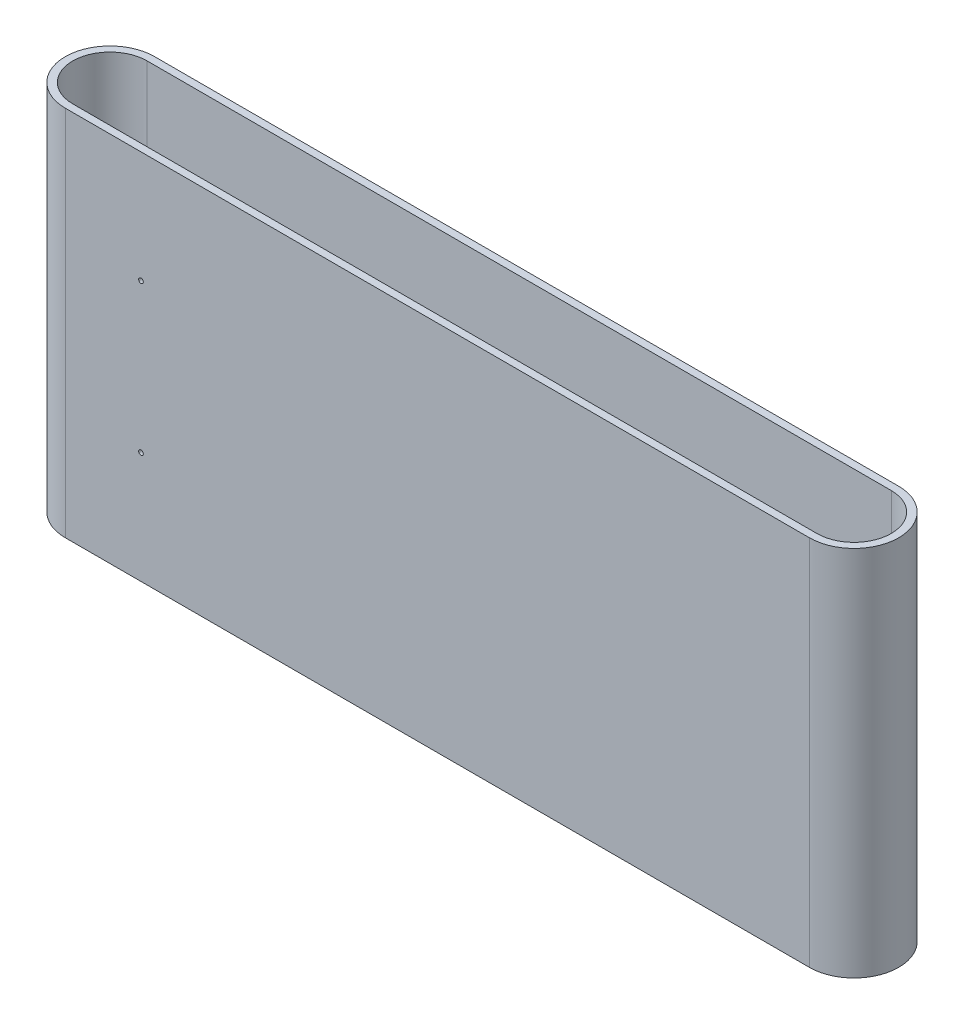
ISO-10303-21;
HEADER;
FILE_DESCRIPTION(('STEP AP214'),'2;1');
FILE_NAME('part.step','',(''),(''),'','','');
FILE_SCHEMA(('AUTOMOTIVE_DESIGN { 1 0 10303 214 1 1 1 1 }'));
ENDSEC;
DATA;
#1=APPLICATION_CONTEXT('core data for automotive mechanical design processes');
#2=APPLICATION_PROTOCOL_DEFINITION('international standard','automotive_design',2000,#1);
#3=PRODUCT_CONTEXT('',#1,'mechanical');
#4=PRODUCT('Part','Part','',(#3));
#5=PRODUCT_RELATED_PRODUCT_CATEGORY('part','',(#4));
#6=PRODUCT_DEFINITION_FORMATION('','',#4);
#7=PRODUCT_DEFINITION_CONTEXT('part definition',#1,'design');
#8=PRODUCT_DEFINITION('design','',#6,#7);
#9=PRODUCT_DEFINITION_SHAPE('','',#8);
#10=(LENGTH_UNIT() NAMED_UNIT(*) SI_UNIT(.MILLI.,.METRE.));
#11=(NAMED_UNIT(*) PLANE_ANGLE_UNIT() SI_UNIT($,.RADIAN.));
#12=(NAMED_UNIT(*) SI_UNIT($,.STERADIAN.) SOLID_ANGLE_UNIT());
#13=UNCERTAINTY_MEASURE_WITH_UNIT(LENGTH_MEASURE(1.E-05),#10,'distance_accuracy_value','');
#14=(GEOMETRIC_REPRESENTATION_CONTEXT(3) GLOBAL_UNCERTAINTY_ASSIGNED_CONTEXT((#13)) GLOBAL_UNIT_ASSIGNED_CONTEXT((#10,
#11,#12)) REPRESENTATION_CONTEXT('',''));
#15=CARTESIAN_POINT('',(0.,0.,0.));
#16=DIRECTION('',(0.,0.,1.));
#17=DIRECTION('',(1.,0.,0.));
#18=AXIS2_PLACEMENT_3D('',#15,#16,#17);
#19=CARTESIAN_POINT('',(0.,200.,0.));
#20=DIRECTION('',(0.,1.,0.));
#21=DIRECTION('',(0.,0.,1.));
#22=AXIS2_PLACEMENT_3D('',#19,#20,#21);
#23=PLANE('',#22);
#24=CARTESIAN_POINT('',(0.,200.,0.));
#25=DIRECTION('',(0.,1.,0.));
#26=DIRECTION('',(1.,0.,0.));
#27=AXIS2_PLACEMENT_3D('',#24,#25,#26);
#28=CIRCLE('',#27,24.);
#29=CARTESIAN_POINT('',(0.,200.,-24.));
#30=VERTEX_POINT('',#29);
#31=CARTESIAN_POINT('',(0.,200.,24.));
#32=VERTEX_POINT('',#31);
#33=EDGE_CURVE('E168',#30,#32,#28,.T.);
#34=ORIENTED_EDGE('',*,*,#33,.T.);
#35=DIRECTION('',(1.,0.,0.));
#36=VECTOR('',#35,1.);
#37=CARTESIAN_POINT('',(0.,200.,24.));
#38=LINE('',#37,#36);
#39=CARTESIAN_POINT('',(400.,200.,24.));
#40=VERTEX_POINT('',#39);
#41=EDGE_CURVE('E171',#32,#40,#38,.T.);
#42=ORIENTED_EDGE('',*,*,#41,.T.);
#43=CARTESIAN_POINT('',(400.,200.,0.));
#44=DIRECTION('',(0.,1.,0.));
#45=DIRECTION('',(1.,0.,0.));
#46=AXIS2_PLACEMENT_3D('',#43,#44,#45);
#47=CIRCLE('',#46,24.);
#48=CARTESIAN_POINT('',(400.,200.,-24.));
#49=VERTEX_POINT('',#48);
#50=EDGE_CURVE('E174',#40,#49,#47,.T.);
#51=ORIENTED_EDGE('',*,*,#50,.T.);
#52=DIRECTION('',(-1.,0.,0.));
#53=VECTOR('',#52,1.);
#54=CARTESIAN_POINT('',(0.,200.,-24.));
#55=LINE('',#54,#53);
#56=EDGE_CURVE('E176',#49,#30,#55,.T.);
#57=ORIENTED_EDGE('',*,*,#56,.T.);
#58=EDGE_LOOP('',(#34,#42,#51,#57));
#59=FACE_BOUND('',#58,.T.);
#60=DIRECTION('',(1.,0.,0.));
#61=VECTOR('',#60,1.);
#62=CARTESIAN_POINT('',(0.,200.,20.));
#63=LINE('',#62,#61);
#64=CARTESIAN_POINT('',(0.,200.,20.));
#65=VERTEX_POINT('',#64);
#66=CARTESIAN_POINT('',(400.,200.,20.));
#67=VERTEX_POINT('',#66);
#68=EDGE_CURVE('E138',#65,#67,#63,.T.);
#69=ORIENTED_EDGE('',*,*,#68,.F.);
#70=CARTESIAN_POINT('',(0.,200.,0.));
#71=DIRECTION('',(0.,1.,0.));
#72=DIRECTION('',(0.,0.,1.));
#73=AXIS2_PLACEMENT_3D('',#70,#71,#72);
#74=CIRCLE('',#73,20.);
#75=CARTESIAN_POINT('',(0.,200.,-20.));
#76=VERTEX_POINT('',#75);
#77=EDGE_CURVE('E130',#76,#65,#74,.T.);
#78=ORIENTED_EDGE('',*,*,#77,.F.);
#79=DIRECTION('',(-1.,0.,0.));
#80=VECTOR('',#79,1.);
#81=CARTESIAN_POINT('',(0.,200.,-20.));
#82=LINE('',#81,#80);
#83=CARTESIAN_POINT('',(400.,200.,-20.));
#84=VERTEX_POINT('',#83);
#85=EDGE_CURVE('E152',#84,#76,#82,.T.);
#86=ORIENTED_EDGE('',*,*,#85,.F.);
#87=CARTESIAN_POINT('',(400.,200.,0.));
#88=DIRECTION('',(0.,1.,0.));
#89=DIRECTION('',(0.,0.,1.));
#90=AXIS2_PLACEMENT_3D('',#87,#88,#89);
#91=CIRCLE('',#90,20.);
#92=EDGE_CURVE('E150',#67,#84,#91,.T.);
#93=ORIENTED_EDGE('',*,*,#92,.F.);
#94=EDGE_LOOP('',(#69,#78,#86,#93));
#95=FACE_BOUND('',#94,.T.);
#96=ADVANCED_FACE('F63',(#59,#95),#23,.T.);
#97=CARTESIAN_POINT('',(0.,0.,0.));
#98=DIRECTION('',(0.,1.,0.));
#99=DIRECTION('',(0.,0.,1.));
#100=AXIS2_PLACEMENT_3D('',#97,#98,#99);
#101=PLANE('',#100);
#102=CARTESIAN_POINT('',(0.,0.,0.));
#103=DIRECTION('',(0.,1.,0.));
#104=DIRECTION('',(1.,0.,0.));
#105=AXIS2_PLACEMENT_3D('',#102,#103,#104);
#106=CIRCLE('',#105,24.);
#107=CARTESIAN_POINT('',(0.,0.,-24.));
#108=VERTEX_POINT('',#107);
#109=CARTESIAN_POINT('',(0.,0.,24.));
#110=VERTEX_POINT('',#109);
#111=EDGE_CURVE('E146',#108,#110,#106,.T.);
#112=ORIENTED_EDGE('',*,*,#111,.F.);
#113=DIRECTION('',(-1.,0.,0.));
#114=VECTOR('',#113,1.);
#115=CARTESIAN_POINT('',(0.,0.,-24.));
#116=LINE('',#115,#114);
#117=CARTESIAN_POINT('',(400.,0.,-24.));
#118=VERTEX_POINT('',#117);
#119=EDGE_CURVE('E172',#118,#108,#116,.T.);
#120=ORIENTED_EDGE('',*,*,#119,.F.);
#121=CARTESIAN_POINT('',(400.,0.,0.));
#122=DIRECTION('',(0.,1.,0.));
#123=DIRECTION('',(1.,0.,0.));
#124=AXIS2_PLACEMENT_3D('',#121,#122,#123);
#125=CIRCLE('',#124,24.);
#126=CARTESIAN_POINT('',(400.,0.,24.));
#127=VERTEX_POINT('',#126);
#128=EDGE_CURVE('E183',#127,#118,#125,.T.);
#129=ORIENTED_EDGE('',*,*,#128,.F.);
#130=DIRECTION('',(1.,0.,0.));
#131=VECTOR('',#130,1.);
#132=CARTESIAN_POINT('',(0.,0.,24.));
#133=LINE('',#132,#131);
#134=EDGE_CURVE('E181',#110,#127,#133,.T.);
#135=ORIENTED_EDGE('',*,*,#134,.F.);
#136=EDGE_LOOP('',(#112,#120,#129,#135));
#137=FACE_BOUND('',#136,.T.);
#138=CARTESIAN_POINT('',(0.,0.,0.));
#139=DIRECTION('',(0.,1.,0.));
#140=DIRECTION('',(0.,0.,1.));
#141=AXIS2_PLACEMENT_3D('',#138,#139,#140);
#142=CIRCLE('',#141,20.);
#143=CARTESIAN_POINT('',(0.,0.,-20.));
#144=VERTEX_POINT('',#143);
#145=CARTESIAN_POINT('',(0.,0.,20.));
#146=VERTEX_POINT('',#145);
#147=EDGE_CURVE('E88',#144,#146,#142,.T.);
#148=ORIENTED_EDGE('',*,*,#147,.T.);
#149=DIRECTION('',(1.,0.,0.));
#150=VECTOR('',#149,1.);
#151=CARTESIAN_POINT('',(0.,0.,20.));
#152=LINE('',#151,#150);
#153=CARTESIAN_POINT('',(400.,0.,20.));
#154=VERTEX_POINT('',#153);
#155=EDGE_CURVE('E145',#146,#154,#152,.T.);
#156=ORIENTED_EDGE('',*,*,#155,.T.);
#157=CARTESIAN_POINT('',(400.,0.,0.));
#158=DIRECTION('',(0.,1.,0.));
#159=DIRECTION('',(0.,0.,1.));
#160=AXIS2_PLACEMENT_3D('',#157,#158,#159);
#161=CIRCLE('',#160,20.);
#162=CARTESIAN_POINT('',(400.,0.,-20.));
#163=VERTEX_POINT('',#162);
#164=EDGE_CURVE('E160',#154,#163,#161,.T.);
#165=ORIENTED_EDGE('',*,*,#164,.T.);
#166=DIRECTION('',(-1.,0.,0.));
#167=VECTOR('',#166,1.);
#168=CARTESIAN_POINT('',(0.,0.,-20.));
#169=LINE('',#168,#167);
#170=EDGE_CURVE('E139',#163,#144,#169,.T.);
#171=ORIENTED_EDGE('',*,*,#170,.T.);
#172=EDGE_LOOP('',(#148,#156,#165,#171));
#173=FACE_BOUND('',#172,.T.);
#174=ADVANCED_FACE('F233',(#137,#173),#101,.F.);
#175=CARTESIAN_POINT('',(0.,200.,0.));
#176=DIRECTION('',(0.,-1.,0.));
#177=DIRECTION('',(0.,0.,-1.));
#178=AXIS2_PLACEMENT_3D('',#175,#176,#177);
#179=CYLINDRICAL_SURFACE('',#178,24.);
#180=ORIENTED_EDGE('',*,*,#111,.T.);
#181=DIRECTION('',(0.,-1.,0.));
#182=VECTOR('',#181,1.);
#183=CARTESIAN_POINT('',(0.,200.,24.));
#184=LINE('',#183,#182);
#185=EDGE_CURVE('E12',#32,#110,#184,.T.);
#186=ORIENTED_EDGE('',*,*,#185,.F.);
#187=ORIENTED_EDGE('',*,*,#33,.F.);
#188=DIRECTION('',(0.,-1.,0.));
#189=VECTOR('',#188,1.);
#190=CARTESIAN_POINT('',(0.,200.,-24.));
#191=LINE('',#190,#189);
#192=EDGE_CURVE('E178',#30,#108,#191,.T.);
#193=ORIENTED_EDGE('',*,*,#192,.T.);
#194=EDGE_LOOP('',(#180,#186,#187,#193));
#195=FACE_BOUND('',#194,.T.);
#196=ADVANCED_FACE('F65',(#195),#179,.T.);
#197=CARTESIAN_POINT('',(0.,200.,24.));
#198=DIRECTION('',(0.,0.,-1.));
#199=DIRECTION('',(-1.,0.,0.));
#200=AXIS2_PLACEMENT_3D('',#197,#198,#199);
#201=PLANE('',#200);
#202=CARTESIAN_POINT('',(40.6826775419623,140.,24.));
#203=DIRECTION('',(0.,0.,1.));
#204=DIRECTION('',(1.,0.,0.));
#205=AXIS2_PLACEMENT_3D('',#202,#203,#204);
#206=CIRCLE('',#205,1.24999999999999);
#207=CARTESIAN_POINT('',(41.9326775419623,140.,24.));
#208=VERTEX_POINT('',#207);
#209=EDGE_CURVE('E212',#208,#208,#206,.T.);
#210=ORIENTED_EDGE('',*,*,#209,.F.);
#211=EDGE_LOOP('',(#210));
#212=FACE_BOUND('',#211,.T.);
#213=CARTESIAN_POINT('',(40.6826775419623,60.,24.));
#214=DIRECTION('',(0.,0.,1.));
#215=DIRECTION('',(1.,0.,0.));
#216=AXIS2_PLACEMENT_3D('',#213,#214,#215);
#217=CIRCLE('',#216,1.24999999999999);
#218=CARTESIAN_POINT('',(41.9326775419623,60.,24.));
#219=VERTEX_POINT('',#218);
#220=EDGE_CURVE('E199',#219,#219,#217,.T.);
#221=ORIENTED_EDGE('',*,*,#220,.F.);
#222=EDGE_LOOP('',(#221));
#223=FACE_BOUND('',#222,.T.);
#224=ORIENTED_EDGE('',*,*,#134,.T.);
#225=DIRECTION('',(0.,-1.,0.));
#226=VECTOR('',#225,1.);
#227=CARTESIAN_POINT('',(400.,200.,24.));
#228=LINE('',#227,#226);
#229=EDGE_CURVE('E72',#40,#127,#228,.T.);
#230=ORIENTED_EDGE('',*,*,#229,.F.);
#231=ORIENTED_EDGE('',*,*,#41,.F.);
#232=ORIENTED_EDGE('',*,*,#185,.T.);
#233=EDGE_LOOP('',(#224,#230,#231,#232));
#234=FACE_BOUND('',#233,.T.);
#235=ADVANCED_FACE('F218',(#212,#223,#234),#201,.F.);
#236=CARTESIAN_POINT('',(400.,200.,0.));
#237=DIRECTION('',(0.,-1.,0.));
#238=DIRECTION('',(0.,0.,-1.));
#239=AXIS2_PLACEMENT_3D('',#236,#237,#238);
#240=CYLINDRICAL_SURFACE('',#239,24.);
#241=ORIENTED_EDGE('',*,*,#128,.T.);
#242=DIRECTION('',(0.,-1.,0.));
#243=VECTOR('',#242,1.);
#244=CARTESIAN_POINT('',(400.,200.,-24.));
#245=LINE('',#244,#243);
#246=EDGE_CURVE('E188',#49,#118,#245,.T.);
#247=ORIENTED_EDGE('',*,*,#246,.F.);
#248=ORIENTED_EDGE('',*,*,#50,.F.);
#249=ORIENTED_EDGE('',*,*,#229,.T.);
#250=EDGE_LOOP('',(#241,#247,#248,#249));
#251=FACE_BOUND('',#250,.T.);
#252=ADVANCED_FACE('F221',(#251),#240,.T.);
#253=CARTESIAN_POINT('',(0.,200.,-24.));
#254=DIRECTION('',(0.,0.,1.));
#255=DIRECTION('',(1.,0.,0.));
#256=AXIS2_PLACEMENT_3D('',#253,#254,#255);
#257=PLANE('',#256);
#258=CARTESIAN_POINT('',(40.6826775419623,140.,-24.));
#259=DIRECTION('',(0.,0.,1.));
#260=DIRECTION('',(1.,0.,0.));
#261=AXIS2_PLACEMENT_3D('',#258,#259,#260);
#262=CIRCLE('',#261,1.24999999999999);
#263=CARTESIAN_POINT('',(41.9326775419623,140.,-24.));
#264=VERTEX_POINT('',#263);
#265=EDGE_CURVE('E209',#264,#264,#262,.T.);
#266=ORIENTED_EDGE('',*,*,#265,.T.);
#267=EDGE_LOOP('',(#266));
#268=FACE_BOUND('',#267,.T.);
#269=CARTESIAN_POINT('',(40.6826775419623,60.,-24.));
#270=DIRECTION('',(0.,0.,1.));
#271=DIRECTION('',(1.,0.,0.));
#272=AXIS2_PLACEMENT_3D('',#269,#270,#271);
#273=CIRCLE('',#272,1.24999999999999);
#274=CARTESIAN_POINT('',(41.9326775419623,60.,-24.));
#275=VERTEX_POINT('',#274);
#276=EDGE_CURVE('E194',#275,#275,#273,.T.);
#277=ORIENTED_EDGE('',*,*,#276,.T.);
#278=EDGE_LOOP('',(#277));
#279=FACE_BOUND('',#278,.T.);
#280=ORIENTED_EDGE('',*,*,#119,.T.);
#281=ORIENTED_EDGE('',*,*,#192,.F.);
#282=ORIENTED_EDGE('',*,*,#56,.F.);
#283=ORIENTED_EDGE('',*,*,#246,.T.);
#284=EDGE_LOOP('',(#280,#281,#282,#283));
#285=FACE_BOUND('',#284,.T.);
#286=ADVANCED_FACE('F237',(#268,#279,#285),#257,.F.);
#287=CARTESIAN_POINT('',(0.,200.,0.));
#288=DIRECTION('',(0.,-1.,0.));
#289=DIRECTION('',(0.,0.,-1.));
#290=AXIS2_PLACEMENT_3D('',#287,#288,#289);
#291=CYLINDRICAL_SURFACE('',#290,20.);
#292=ORIENTED_EDGE('',*,*,#147,.F.);
#293=DIRECTION('',(0.,-1.,0.));
#294=VECTOR('',#293,1.);
#295=CARTESIAN_POINT('',(0.,200.,-20.));
#296=LINE('',#295,#294);
#297=EDGE_CURVE('E134',#76,#144,#296,.T.);
#298=ORIENTED_EDGE('',*,*,#297,.F.);
#299=ORIENTED_EDGE('',*,*,#77,.T.);
#300=DIRECTION('',(0.,-1.,0.));
#301=VECTOR('',#300,1.);
#302=CARTESIAN_POINT('',(0.,200.,20.));
#303=LINE('',#302,#301);
#304=EDGE_CURVE('E133',#65,#146,#303,.T.);
#305=ORIENTED_EDGE('',*,*,#304,.T.);
#306=EDGE_LOOP('',(#292,#298,#299,#305));
#307=FACE_BOUND('',#306,.T.);
#308=ADVANCED_FACE('F132',(#307),#291,.F.);
#309=CARTESIAN_POINT('',(0.,200.,20.));
#310=DIRECTION('',(0.,0.,-1.));
#311=DIRECTION('',(-1.,0.,0.));
#312=AXIS2_PLACEMENT_3D('',#309,#310,#311);
#313=PLANE('',#312);
#314=CARTESIAN_POINT('',(40.6826775419623,140.,20.));
#315=DIRECTION('',(0.,0.,-1.));
#316=DIRECTION('',(-1.,0.,0.));
#317=AXIS2_PLACEMENT_3D('',#314,#315,#316);
#318=CIRCLE('',#317,1.24999999999999);
#319=CARTESIAN_POINT('',(39.4326775419623,140.,20.));
#320=VERTEX_POINT('',#319);
#321=EDGE_CURVE('E67',#320,#320,#318,.T.);
#322=ORIENTED_EDGE('',*,*,#321,.F.);
#323=EDGE_LOOP('',(#322));
#324=FACE_BOUND('',#323,.T.);
#325=CARTESIAN_POINT('',(40.6826775419623,60.,20.));
#326=DIRECTION('',(0.,0.,-1.));
#327=DIRECTION('',(-1.,0.,0.));
#328=AXIS2_PLACEMENT_3D('',#325,#326,#327);
#329=CIRCLE('',#328,1.24999999999999);
#330=CARTESIAN_POINT('',(39.4326775419623,60.,20.));
#331=VERTEX_POINT('',#330);
#332=EDGE_CURVE('E158',#331,#331,#329,.T.);
#333=ORIENTED_EDGE('',*,*,#332,.F.);
#334=EDGE_LOOP('',(#333));
#335=FACE_BOUND('',#334,.T.);
#336=ORIENTED_EDGE('',*,*,#155,.F.);
#337=ORIENTED_EDGE('',*,*,#304,.F.);
#338=ORIENTED_EDGE('',*,*,#68,.T.);
#339=DIRECTION('',(0.,-1.,0.));
#340=VECTOR('',#339,1.);
#341=CARTESIAN_POINT('',(400.,200.,20.));
#342=LINE('',#341,#340);
#343=EDGE_CURVE('E147',#67,#154,#342,.T.);
#344=ORIENTED_EDGE('',*,*,#343,.T.);
#345=EDGE_LOOP('',(#336,#337,#338,#344));
#346=FACE_BOUND('',#345,.T.);
#347=ADVANCED_FACE('F142',(#324,#335,#346),#313,.T.);
#348=CARTESIAN_POINT('',(400.,200.,0.));
#349=DIRECTION('',(0.,-1.,0.));
#350=DIRECTION('',(0.,0.,-1.));
#351=AXIS2_PLACEMENT_3D('',#348,#349,#350);
#352=CYLINDRICAL_SURFACE('',#351,20.);
#353=ORIENTED_EDGE('',*,*,#164,.F.);
#354=ORIENTED_EDGE('',*,*,#343,.F.);
#355=ORIENTED_EDGE('',*,*,#92,.T.);
#356=DIRECTION('',(0.,-1.,0.));
#357=VECTOR('',#356,1.);
#358=CARTESIAN_POINT('',(400.,200.,-20.));
#359=LINE('',#358,#357);
#360=EDGE_CURVE('E80',#84,#163,#359,.T.);
#361=ORIENTED_EDGE('',*,*,#360,.T.);
#362=EDGE_LOOP('',(#353,#354,#355,#361));
#363=FACE_BOUND('',#362,.T.);
#364=ADVANCED_FACE('F278',(#363),#352,.F.);
#365=CARTESIAN_POINT('',(0.,200.,-20.));
#366=DIRECTION('',(0.,0.,1.));
#367=DIRECTION('',(1.,0.,0.));
#368=AXIS2_PLACEMENT_3D('',#365,#366,#367);
#369=PLANE('',#368);
#370=CARTESIAN_POINT('',(40.6826775419623,140.,-20.));
#371=DIRECTION('',(0.,0.,1.));
#372=DIRECTION('',(1.,0.,0.));
#373=AXIS2_PLACEMENT_3D('',#370,#371,#372);
#374=CIRCLE('',#373,1.24999999999999);
#375=CARTESIAN_POINT('',(41.9326775419623,140.,-20.));
#376=VERTEX_POINT('',#375);
#377=EDGE_CURVE('E204',#376,#376,#374,.T.);
#378=ORIENTED_EDGE('',*,*,#377,.F.);
#379=EDGE_LOOP('',(#378));
#380=FACE_BOUND('',#379,.T.);
#381=CARTESIAN_POINT('',(40.6826775419623,60.,-20.));
#382=DIRECTION('',(0.,0.,1.));
#383=DIRECTION('',(1.,0.,0.));
#384=AXIS2_PLACEMENT_3D('',#381,#382,#383);
#385=CIRCLE('',#384,1.24999999999999);
#386=CARTESIAN_POINT('',(41.9326775419623,60.,-20.));
#387=VERTEX_POINT('',#386);
#388=EDGE_CURVE('E192',#387,#387,#385,.T.);
#389=ORIENTED_EDGE('',*,*,#388,.F.);
#390=EDGE_LOOP('',(#389));
#391=FACE_BOUND('',#390,.T.);
#392=ORIENTED_EDGE('',*,*,#170,.F.);
#393=ORIENTED_EDGE('',*,*,#360,.F.);
#394=ORIENTED_EDGE('',*,*,#85,.T.);
#395=ORIENTED_EDGE('',*,*,#297,.T.);
#396=EDGE_LOOP('',(#392,#393,#394,#395));
#397=FACE_BOUND('',#396,.T.);
#398=ADVANCED_FACE('F285',(#380,#391,#397),#369,.T.);
#399=CARTESIAN_POINT('',(40.6826775419623,60.,24.));
#400=DIRECTION('',(0.,0.,1.));
#401=DIRECTION('',(1.,0.,0.));
#402=AXIS2_PLACEMENT_3D('',#399,#400,#401);
#403=CYLINDRICAL_SURFACE('',#402,1.24999999999999);
#404=ORIENTED_EDGE('',*,*,#388,.T.);
#405=EDGE_LOOP('',(#404));
#406=FACE_BOUND('',#405,.T.);
#407=ORIENTED_EDGE('',*,*,#276,.F.);
#408=EDGE_LOOP('',(#407));
#409=FACE_BOUND('',#408,.T.);
#410=ADVANCED_FACE('F292',(#406,#409),#403,.F.);
#411=ORIENTED_EDGE('',*,*,#332,.T.);
#412=EDGE_LOOP('',(#411));
#413=FACE_BOUND('',#412,.T.);
#414=ORIENTED_EDGE('',*,*,#220,.T.);
#415=EDGE_LOOP('',(#414));
#416=FACE_BOUND('',#415,.T.);
#417=ADVANCED_FACE('F301',(#413,#416),#403,.F.);
#418=CARTESIAN_POINT('',(40.6826775419623,140.,24.));
#419=DIRECTION('',(0.,0.,1.));
#420=DIRECTION('',(1.,0.,0.));
#421=AXIS2_PLACEMENT_3D('',#418,#419,#420);
#422=CYLINDRICAL_SURFACE('',#421,1.24999999999999);
#423=ORIENTED_EDGE('',*,*,#321,.T.);
#424=EDGE_LOOP('',(#423));
#425=FACE_BOUND('',#424,.T.);
#426=ORIENTED_EDGE('',*,*,#209,.T.);
#427=EDGE_LOOP('',(#426));
#428=FACE_BOUND('',#427,.T.);
#429=ADVANCED_FACE('F216',(#425,#428),#422,.F.);
#430=ORIENTED_EDGE('',*,*,#377,.T.);
#431=EDGE_LOOP('',(#430));
#432=FACE_BOUND('',#431,.T.);
#433=ORIENTED_EDGE('',*,*,#265,.F.);
#434=EDGE_LOOP('',(#433));
#435=FACE_BOUND('',#434,.T.);
#436=ADVANCED_FACE('F315',(#432,#435),#422,.F.);
#437=CLOSED_SHELL('',(#96,#174,#196,#235,#252,#286,#308,#347,#364,#398,#410,#417,#429,#436));
#438=MANIFOLD_SOLID_BREP('B2',#437);
#439=ADVANCED_BREP_SHAPE_REPRESENTATION('',(#18,#438),#14);
#440=SHAPE_DEFINITION_REPRESENTATION(#9,#439);
ENDSEC;
END-ISO-10303-21;
